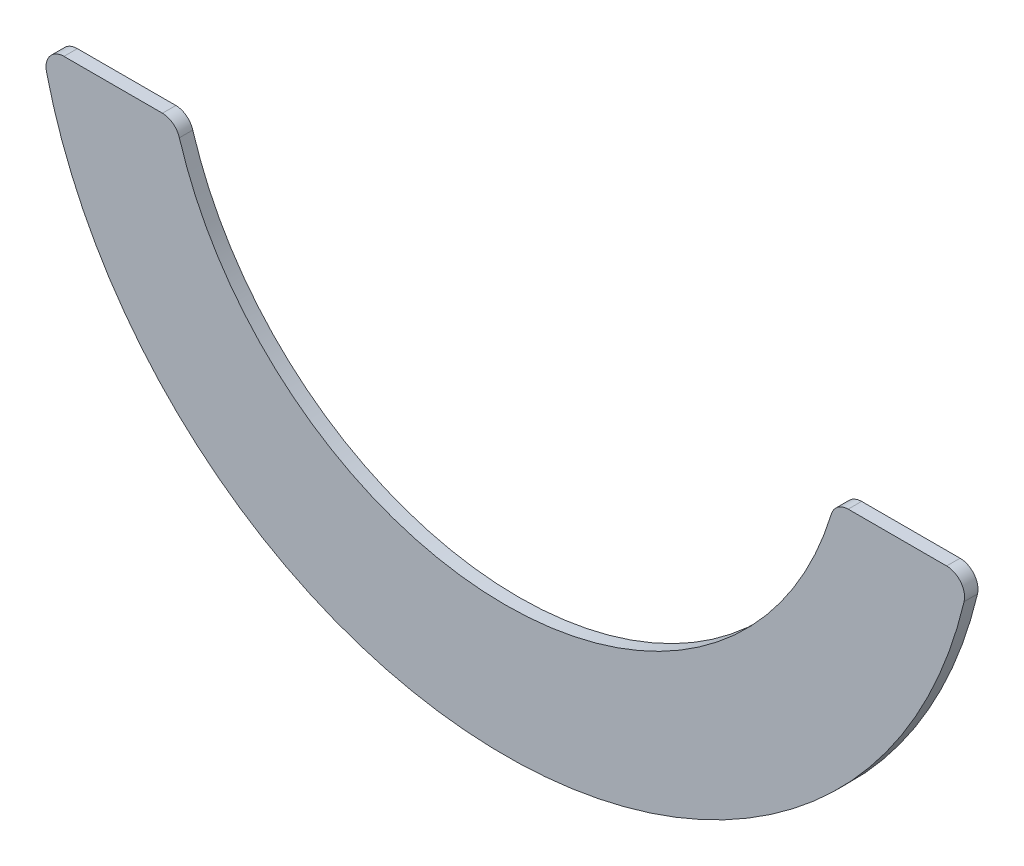
ISO-10303-21;
HEADER;
FILE_DESCRIPTION(('STEP AP214'),'2;1');
FILE_NAME('part.step','',(''),(''),'','','');
FILE_SCHEMA(('AUTOMOTIVE_DESIGN { 1 0 10303 214 1 1 1 1 }'));
ENDSEC;
DATA;
#1=APPLICATION_CONTEXT('core data for automotive mechanical design processes');
#2=APPLICATION_PROTOCOL_DEFINITION('international standard','automotive_design',2000,#1);
#3=PRODUCT_CONTEXT('',#1,'mechanical');
#4=PRODUCT('Part','Part','',(#3));
#5=PRODUCT_RELATED_PRODUCT_CATEGORY('part','',(#4));
#6=PRODUCT_DEFINITION_FORMATION('','',#4);
#7=PRODUCT_DEFINITION_CONTEXT('part definition',#1,'design');
#8=PRODUCT_DEFINITION('design','',#6,#7);
#9=PRODUCT_DEFINITION_SHAPE('','',#8);
#10=(LENGTH_UNIT() NAMED_UNIT(*) SI_UNIT(.MILLI.,.METRE.));
#11=(NAMED_UNIT(*) PLANE_ANGLE_UNIT() SI_UNIT($,.RADIAN.));
#12=(NAMED_UNIT(*) SI_UNIT($,.STERADIAN.) SOLID_ANGLE_UNIT());
#13=UNCERTAINTY_MEASURE_WITH_UNIT(LENGTH_MEASURE(1.E-05),#10,'distance_accuracy_value','');
#14=(GEOMETRIC_REPRESENTATION_CONTEXT(3) GLOBAL_UNCERTAINTY_ASSIGNED_CONTEXT((#13)) GLOBAL_UNIT_ASSIGNED_CONTEXT((#10,
#11,#12)) REPRESENTATION_CONTEXT('',''));
#15=CARTESIAN_POINT('',(0.,0.,0.));
#16=DIRECTION('',(0.,0.,1.));
#17=DIRECTION('',(1.,0.,0.));
#18=AXIS2_PLACEMENT_3D('',#15,#16,#17);
#19=CARTESIAN_POINT('',(0.,0.,0.05));
#20=DIRECTION('',(0.,0.,1.));
#21=DIRECTION('',(1.,0.,0.));
#22=AXIS2_PLACEMENT_3D('',#19,#20,#21);
#23=PLANE('',#22);
#24=DIRECTION('',(1.,0.,0.));
#25=VECTOR('',#24,1.);
#26=CARTESIAN_POINT('',(0.,-0.087122,0.05));
#27=LINE('',#26,#25);
#28=CARTESIAN_POINT('',(1.643888,-0.0871219999999843,0.05));
#29=VERTEX_POINT('',#28);
#30=CARTESIAN_POINT('',(1.277112,-0.087122,0.05));
#31=VERTEX_POINT('',#30);
#32=EDGE_CURVE('E85',#29,#31,#27,.F.);
#33=ORIENTED_EDGE('',*,*,#32,.T.);
#34=CARTESIAN_POINT('',(1.27812385544,-0.1538807029215,0.05));
#35=DIRECTION('',(0.,0.,1.));
#36=DIRECTION('',(1.,0.,0.));
#37=AXIS2_PLACEMENT_3D('',#34,#35,#36);
#38=CIRCLE('',#37,0.06676637078044);
#39=CARTESIAN_POINT('',(1.21411999999961,-0.134873999999882,0.05));
#40=VERTEX_POINT('',#39);
#41=EDGE_CURVE('E117',#40,#31,#38,.F.);
#42=ORIENTED_EDGE('',*,*,#41,.F.);
#43=CARTESIAN_POINT('',(-0.000381,0.2343703805654,0.05));
#44=DIRECTION('',(0.,0.,1.));
#45=DIRECTION('',(1.,0.,0.));
#46=AXIS2_PLACEMENT_3D('',#43,#44,#45);
#47=CIRCLE('',#46,1.269391228731);
#48=CARTESIAN_POINT('',(-1.21488199999998,-0.134873999999993,0.05));
#49=VERTEX_POINT('',#48);
#50=EDGE_CURVE('E116',#40,#49,#47,.F.);
#51=ORIENTED_EDGE('',*,*,#50,.T.);
#52=CARTESIAN_POINT('',(-1.27903871551,-0.1540823481196,0.05));
#53=DIRECTION('',(0.,0.,1.));
#54=DIRECTION('',(1.,0.,0.));
#55=AXIS2_PLACEMENT_3D('',#52,#53,#54);
#56=CIRCLE('',#55,0.06697047694707);
#57=CARTESIAN_POINT('',(-1.27787399999983,-0.087122,0.05));
#58=VERTEX_POINT('',#57);
#59=EDGE_CURVE('E112',#58,#49,#56,.F.);
#60=ORIENTED_EDGE('',*,*,#59,.F.);
#61=DIRECTION('',(1.,0.,0.));
#62=VECTOR('',#61,1.);
#63=CARTESIAN_POINT('',(-1.277874,-0.087122,0.05));
#64=LINE('',#63,#62);
#65=CARTESIAN_POINT('',(-1.644904,-0.087121999999989,0.05));
#66=VERTEX_POINT('',#65);
#67=EDGE_CURVE('E109',#66,#58,#64,.T.);
#68=ORIENTED_EDGE('',*,*,#67,.F.);
#69=CARTESIAN_POINT('',(-1.644695801976,-0.1542183886324,0.05));
#70=DIRECTION('',(0.,0.,1.));
#71=DIRECTION('',(1.,0.,0.));
#72=AXIS2_PLACEMENT_3D('',#69,#70,#71);
#73=CIRCLE('',#72,0.06709671164766);
#74=CARTESIAN_POINT('',(-1.70992800000009,-0.169926000000021,0.05));
#75=VERTEX_POINT('',#74);
#76=EDGE_CURVE('E89',#75,#66,#73,.F.);
#77=ORIENTED_EDGE('',*,*,#76,.F.);
#78=CARTESIAN_POINT('',(-0.000508,0.2353061507289,0.05));
#79=DIRECTION('',(0.,0.,1.));
#80=DIRECTION('',(1.,0.,0.));
#81=AXIS2_PLACEMENT_3D('',#78,#79,#80);
#82=CIRCLE('',#81,1.756795330249);
#83=CARTESIAN_POINT('',(1.70891199999967,-0.169925999999922,0.05));
#84=VERTEX_POINT('',#83);
#85=EDGE_CURVE('E87',#84,#75,#82,.F.);
#86=ORIENTED_EDGE('',*,*,#85,.F.);
#87=CARTESIAN_POINT('',(1.643578524463,-0.1542979194398,0.05));
#88=DIRECTION('',(0.,0.,1.));
#89=DIRECTION('',(1.,0.,0.));
#90=AXIS2_PLACEMENT_3D('',#87,#88,#89);
#91=CIRCLE('',#90,0.06717663230391);
#92=EDGE_CURVE('E20',#84,#29,#91,.T.);
#93=ORIENTED_EDGE('',*,*,#92,.T.);
#94=EDGE_LOOP('',(#33,#42,#51,#60,#68,#77,#86,#93));
#95=FACE_BOUND('',#94,.T.);
#96=ADVANCED_FACE('F17',(#95),#23,.T.);
#97=CARTESIAN_POINT('',(1.27812385544,-0.1538807029215,0.));
#98=DIRECTION('',(0.,0.,1.));
#99=DIRECTION('',(1.,0.,0.));
#100=AXIS2_PLACEMENT_3D('',#97,#98,#99);
#101=CYLINDRICAL_SURFACE('',#100,0.06676637078044);
#102=DIRECTION('',(0.,0.,1.));
#103=VECTOR('',#102,1.);
#104=CARTESIAN_POINT('',(1.277112,-0.087122,0.));
#105=LINE('',#104,#103);
#106=CARTESIAN_POINT('',(1.277112,-0.0871220000000051,0.));
#107=VERTEX_POINT('',#106);
#108=EDGE_CURVE('E99',#107,#31,#105,.T.);
#109=ORIENTED_EDGE('',*,*,#108,.F.);
#110=CARTESIAN_POINT('',(1.27812385544,-0.1538807029215,0.));
#111=DIRECTION('',(0.,0.,1.));
#112=DIRECTION('',(1.,0.,0.));
#113=AXIS2_PLACEMENT_3D('',#110,#111,#112);
#114=CIRCLE('',#113,0.06676637078044);
#115=CARTESIAN_POINT('',(1.21411999999965,-0.134873999999894,0.));
#116=VERTEX_POINT('',#115);
#117=EDGE_CURVE('E132',#107,#116,#114,.T.);
#118=ORIENTED_EDGE('',*,*,#117,.T.);
#119=DIRECTION('',(0.,0.,1.));
#120=VECTOR('',#119,1.);
#121=CARTESIAN_POINT('',(1.21411999999965,-0.134873999999894,0.));
#122=LINE('',#121,#120);
#123=EDGE_CURVE('E113',#116,#40,#122,.T.);
#124=ORIENTED_EDGE('',*,*,#123,.T.);
#125=ORIENTED_EDGE('',*,*,#41,.T.);
#126=EDGE_LOOP('',(#109,#118,#124,#125));
#127=FACE_BOUND('',#126,.T.);
#128=ADVANCED_FACE('F141',(#127),#101,.T.);
#129=CARTESIAN_POINT('',(-0.000381,0.2343703805654,0.));
#130=DIRECTION('',(0.,0.,1.));
#131=DIRECTION('',(1.,0.,0.));
#132=AXIS2_PLACEMENT_3D('',#129,#130,#131);
#133=CYLINDRICAL_SURFACE('',#132,1.269391228731);
#134=ORIENTED_EDGE('',*,*,#50,.F.);
#135=ORIENTED_EDGE('',*,*,#123,.F.);
#136=CARTESIAN_POINT('',(-0.000381,0.2343703805654,0.));
#137=DIRECTION('',(0.,0.,1.));
#138=DIRECTION('',(1.,0.,0.));
#139=AXIS2_PLACEMENT_3D('',#136,#137,#138);
#140=CIRCLE('',#139,1.269391228731);
#141=CARTESIAN_POINT('',(-1.21488199999998,-0.134873999999993,0.));
#142=VERTEX_POINT('',#141);
#143=EDGE_CURVE('E129',#116,#142,#140,.F.);
#144=ORIENTED_EDGE('',*,*,#143,.T.);
#145=DIRECTION('',(0.,0.,1.));
#146=VECTOR('',#145,1.);
#147=CARTESIAN_POINT('',(-1.21488199999998,-0.134873999999993,0.));
#148=LINE('',#147,#146);
#149=EDGE_CURVE('E110',#49,#142,#148,.F.);
#150=ORIENTED_EDGE('',*,*,#149,.F.);
#151=EDGE_LOOP('',(#134,#135,#144,#150));
#152=FACE_BOUND('',#151,.T.);
#153=ADVANCED_FACE('F151',(#152),#133,.F.);
#154=CARTESIAN_POINT('',(-1.27903871551,-0.1540823481196,0.));
#155=DIRECTION('',(0.,0.,1.));
#156=DIRECTION('',(1.,0.,0.));
#157=AXIS2_PLACEMENT_3D('',#154,#155,#156);
#158=CYLINDRICAL_SURFACE('',#157,0.06697047694707);
#159=ORIENTED_EDGE('',*,*,#149,.T.);
#160=CARTESIAN_POINT('',(-1.27903871551,-0.1540823481196,0.));
#161=DIRECTION('',(0.,0.,1.));
#162=DIRECTION('',(1.,0.,0.));
#163=AXIS2_PLACEMENT_3D('',#160,#161,#162);
#164=CIRCLE('',#163,0.06697047694707);
#165=CARTESIAN_POINT('',(-1.27787399999983,-0.087122,0.));
#166=VERTEX_POINT('',#165);
#167=EDGE_CURVE('E126',#142,#166,#164,.T.);
#168=ORIENTED_EDGE('',*,*,#167,.T.);
#169=DIRECTION('',(0.,0.,1.));
#170=VECTOR('',#169,1.);
#171=CARTESIAN_POINT('',(-1.277874,-0.087122,0.));
#172=LINE('',#171,#170);
#173=EDGE_CURVE('E107',#58,#166,#172,.F.);
#174=ORIENTED_EDGE('',*,*,#173,.F.);
#175=ORIENTED_EDGE('',*,*,#59,.T.);
#176=EDGE_LOOP('',(#159,#168,#174,#175));
#177=FACE_BOUND('',#176,.T.);
#178=ADVANCED_FACE('F156',(#177),#158,.T.);
#179=CARTESIAN_POINT('',(-1.277874,-0.087122,0.));
#180=DIRECTION('',(0.,1.,0.));
#181=DIRECTION('',(0.,0.,1.));
#182=AXIS2_PLACEMENT_3D('',#179,#180,#181);
#183=PLANE('',#182);
#184=ORIENTED_EDGE('',*,*,#173,.T.);
#185=DIRECTION('',(1.,0.,0.));
#186=VECTOR('',#185,1.);
#187=CARTESIAN_POINT('',(0.,-0.087122,0.));
#188=LINE('',#187,#186);
#189=CARTESIAN_POINT('',(-1.644904,-0.087121999999989,0.));
#190=VERTEX_POINT('',#189);
#191=EDGE_CURVE('E125',#166,#190,#188,.F.);
#192=ORIENTED_EDGE('',*,*,#191,.T.);
#193=DIRECTION('',(0.,0.,1.));
#194=VECTOR('',#193,1.);
#195=CARTESIAN_POINT('',(-1.644904,-0.0871219999999853,0.));
#196=LINE('',#195,#194);
#197=EDGE_CURVE('E93',#66,#190,#196,.F.);
#198=ORIENTED_EDGE('',*,*,#197,.F.);
#199=ORIENTED_EDGE('',*,*,#67,.T.);
#200=EDGE_LOOP('',(#184,#192,#198,#199));
#201=FACE_BOUND('',#200,.T.);
#202=ADVANCED_FACE('F159',(#201),#183,.T.);
#203=CARTESIAN_POINT('',(-1.644695801976,-0.1542183886324,0.));
#204=DIRECTION('',(0.,0.,1.));
#205=DIRECTION('',(1.,0.,0.));
#206=AXIS2_PLACEMENT_3D('',#203,#204,#205);
#207=CYLINDRICAL_SURFACE('',#206,0.06709671164766);
#208=ORIENTED_EDGE('',*,*,#197,.T.);
#209=CARTESIAN_POINT('',(-1.644695801976,-0.1542183886324,0.));
#210=DIRECTION('',(0.,0.,1.));
#211=DIRECTION('',(1.,0.,0.));
#212=AXIS2_PLACEMENT_3D('',#209,#210,#211);
#213=CIRCLE('',#212,0.06709671164766);
#214=CARTESIAN_POINT('',(-1.70992800000009,-0.169926000000021,0.));
#215=VERTEX_POINT('',#214);
#216=EDGE_CURVE('E122',#190,#215,#213,.T.);
#217=ORIENTED_EDGE('',*,*,#216,.T.);
#218=DIRECTION('',(0.,0.,1.));
#219=VECTOR('',#218,1.);
#220=CARTESIAN_POINT('',(-1.70992800000009,-0.169926000000021,0.));
#221=LINE('',#220,#219);
#222=EDGE_CURVE('E92',#75,#215,#221,.F.);
#223=ORIENTED_EDGE('',*,*,#222,.F.);
#224=ORIENTED_EDGE('',*,*,#76,.T.);
#225=EDGE_LOOP('',(#208,#217,#223,#224));
#226=FACE_BOUND('',#225,.T.);
#227=ADVANCED_FACE('F163',(#226),#207,.T.);
#228=CARTESIAN_POINT('',(-0.000508,0.2353061507289,0.));
#229=DIRECTION('',(0.,0.,1.));
#230=DIRECTION('',(1.,0.,0.));
#231=AXIS2_PLACEMENT_3D('',#228,#229,#230);
#232=CYLINDRICAL_SURFACE('',#231,1.756795330249);
#233=ORIENTED_EDGE('',*,*,#222,.T.);
#234=CARTESIAN_POINT('',(-0.000508,0.2353061507289,0.));
#235=DIRECTION('',(0.,0.,1.));
#236=DIRECTION('',(1.,0.,0.));
#237=AXIS2_PLACEMENT_3D('',#234,#235,#236);
#238=CIRCLE('',#237,1.756795330249);
#239=CARTESIAN_POINT('',(1.70891199999967,-0.169925999999922,0.));
#240=VERTEX_POINT('',#239);
#241=EDGE_CURVE('E98',#215,#240,#238,.T.);
#242=ORIENTED_EDGE('',*,*,#241,.T.);
#243=DIRECTION('',(0.,0.,1.));
#244=VECTOR('',#243,1.);
#245=CARTESIAN_POINT('',(1.70891199999967,-0.169925999999922,0.));
#246=LINE('',#245,#244);
#247=EDGE_CURVE('E82',#84,#240,#246,.F.);
#248=ORIENTED_EDGE('',*,*,#247,.F.);
#249=ORIENTED_EDGE('',*,*,#85,.T.);
#250=EDGE_LOOP('',(#233,#242,#248,#249));
#251=FACE_BOUND('',#250,.T.);
#252=ADVANCED_FACE('F96',(#251),#232,.T.);
#253=CARTESIAN_POINT('',(1.643578524463,-0.1542979194398,0.));
#254=DIRECTION('',(0.,0.,1.));
#255=DIRECTION('',(1.,0.,0.));
#256=AXIS2_PLACEMENT_3D('',#253,#254,#255);
#257=CYLINDRICAL_SURFACE('',#256,0.06717663230391);
#258=ORIENTED_EDGE('',*,*,#247,.T.);
#259=CARTESIAN_POINT('',(1.643578524463,-0.1542979194398,0.));
#260=DIRECTION('',(0.,0.,1.));
#261=DIRECTION('',(1.,0.,0.));
#262=AXIS2_PLACEMENT_3D('',#259,#260,#261);
#263=CIRCLE('',#262,0.06717663230391);
#264=CARTESIAN_POINT('',(1.643888,-0.087122,0.));
#265=VERTEX_POINT('',#264);
#266=EDGE_CURVE('E26',#240,#265,#263,.T.);
#267=ORIENTED_EDGE('',*,*,#266,.T.);
#268=DIRECTION('',(0.,0.,1.));
#269=VECTOR('',#268,1.);
#270=CARTESIAN_POINT('',(1.643888,-0.087122,0.));
#271=LINE('',#270,#269);
#272=EDGE_CURVE('E34',#29,#265,#271,.F.);
#273=ORIENTED_EDGE('',*,*,#272,.F.);
#274=ORIENTED_EDGE('',*,*,#92,.F.);
#275=EDGE_LOOP('',(#258,#267,#273,#274));
#276=FACE_BOUND('',#275,.T.);
#277=ADVANCED_FACE('F79',(#276),#257,.T.);
#278=CARTESIAN_POINT('',(1.643888,-0.087122,0.));
#279=DIRECTION('',(0.,1.,0.));
#280=DIRECTION('',(0.,0.,1.));
#281=AXIS2_PLACEMENT_3D('',#278,#279,#280);
#282=PLANE('',#281);
#283=ORIENTED_EDGE('',*,*,#272,.T.);
#284=DIRECTION('',(1.,0.,0.));
#285=VECTOR('',#284,1.);
#286=CARTESIAN_POINT('',(0.,-0.087122,0.));
#287=LINE('',#286,#285);
#288=EDGE_CURVE('E11',#265,#107,#287,.F.);
#289=ORIENTED_EDGE('',*,*,#288,.T.);
#290=ORIENTED_EDGE('',*,*,#108,.T.);
#291=ORIENTED_EDGE('',*,*,#32,.F.);
#292=EDGE_LOOP('',(#283,#289,#290,#291));
#293=FACE_BOUND('',#292,.T.);
#294=ADVANCED_FACE('F143',(#293),#282,.T.);
#295=CARTESIAN_POINT('',(0.,0.,0.));
#296=DIRECTION('',(0.,0.,1.));
#297=DIRECTION('',(1.,0.,0.));
#298=AXIS2_PLACEMENT_3D('',#295,#296,#297);
#299=PLANE('',#298);
#300=ORIENTED_EDGE('',*,*,#266,.F.);
#301=ORIENTED_EDGE('',*,*,#241,.F.);
#302=ORIENTED_EDGE('',*,*,#216,.F.);
#303=ORIENTED_EDGE('',*,*,#191,.F.);
#304=ORIENTED_EDGE('',*,*,#167,.F.);
#305=ORIENTED_EDGE('',*,*,#143,.F.);
#306=ORIENTED_EDGE('',*,*,#117,.F.);
#307=ORIENTED_EDGE('',*,*,#288,.F.);
#308=EDGE_LOOP('',(#300,#301,#302,#303,#304,#305,#306,#307));
#309=FACE_BOUND('',#308,.T.);
#310=ADVANCED_FACE('F145',(#309),#299,.F.);
#311=CLOSED_SHELL('',(#96,#128,#153,#178,#202,#227,#252,#277,#294,#310));
#312=MANIFOLD_SOLID_BREP('B1',#311);
#313=ADVANCED_BREP_SHAPE_REPRESENTATION('',(#18,#312),#14);
#314=SHAPE_DEFINITION_REPRESENTATION(#9,#313);
ENDSEC;
END-ISO-10303-21;
